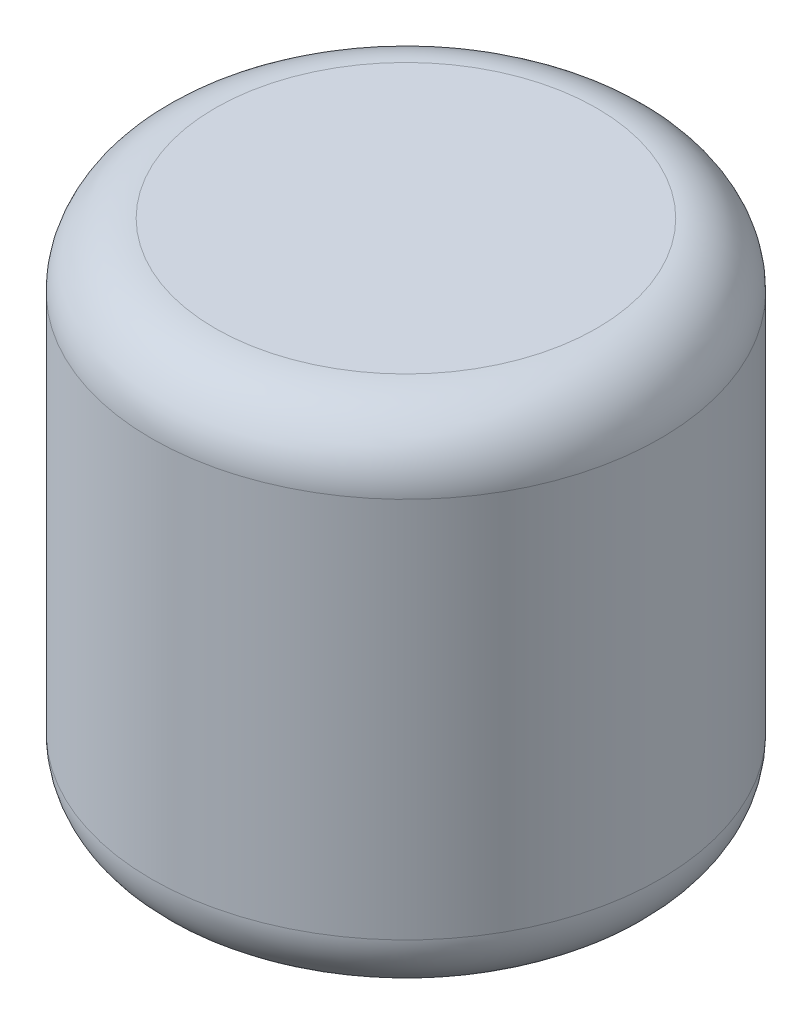
ISO-10303-21;
HEADER;
FILE_DESCRIPTION(('STEP AP214'),'2;1');
FILE_NAME('part.step','',(''),(''),'','','');
FILE_SCHEMA(('AUTOMOTIVE_DESIGN { 1 0 10303 214 1 1 1 1 }'));
ENDSEC;
DATA;
#1=APPLICATION_CONTEXT('core data for automotive mechanical design processes');
#2=APPLICATION_PROTOCOL_DEFINITION('international standard','automotive_design',2000,#1);
#3=PRODUCT_CONTEXT('',#1,'mechanical');
#4=PRODUCT('Part','Part','',(#3));
#5=PRODUCT_RELATED_PRODUCT_CATEGORY('part','',(#4));
#6=PRODUCT_DEFINITION_FORMATION('','',#4);
#7=PRODUCT_DEFINITION_CONTEXT('part definition',#1,'design');
#8=PRODUCT_DEFINITION('design','',#6,#7);
#9=PRODUCT_DEFINITION_SHAPE('','',#8);
#10=(LENGTH_UNIT() NAMED_UNIT(*) SI_UNIT(.MILLI.,.METRE.));
#11=(NAMED_UNIT(*) PLANE_ANGLE_UNIT() SI_UNIT($,.RADIAN.));
#12=(NAMED_UNIT(*) SI_UNIT($,.STERADIAN.) SOLID_ANGLE_UNIT());
#13=UNCERTAINTY_MEASURE_WITH_UNIT(LENGTH_MEASURE(1.E-05),#10,'distance_accuracy_value','');
#14=(GEOMETRIC_REPRESENTATION_CONTEXT(3) GLOBAL_UNCERTAINTY_ASSIGNED_CONTEXT((#13)) GLOBAL_UNIT_ASSIGNED_CONTEXT((#10,
#11,#12)) REPRESENTATION_CONTEXT('',''));
#15=CARTESIAN_POINT('',(0.,0.,0.));
#16=DIRECTION('',(0.,0.,1.));
#17=DIRECTION('',(1.,0.,0.));
#18=AXIS2_PLACEMENT_3D('',#15,#16,#17);
#19=CARTESIAN_POINT('',(0.,2.,0.));
#20=DIRECTION('',(0.,-1.,0.));
#21=DIRECTION('',(0.,0.,-1.));
#22=AXIS2_PLACEMENT_3D('',#19,#20,#21);
#23=CYLINDRICAL_SURFACE('',#22,2.);
#24=CARTESIAN_POINT('',(0.,-1.5,0.));
#25=DIRECTION('',(0.,1.,0.));
#26=DIRECTION('',(0.,0.,1.));
#27=AXIS2_PLACEMENT_3D('',#24,#25,#26);
#28=CIRCLE('',#27,2.);
#29=CARTESIAN_POINT('',(0.,-1.5,2.));
#30=VERTEX_POINT('',#29);
#31=EDGE_CURVE('E43',#30,#30,#28,.T.);
#32=ORIENTED_EDGE('',*,*,#31,.T.);
#33=EDGE_LOOP('',(#32));
#34=FACE_BOUND('',#33,.T.);
#35=CARTESIAN_POINT('',(0.,1.5,0.));
#36=DIRECTION('',(0.,1.,0.));
#37=DIRECTION('',(0.,0.,1.));
#38=AXIS2_PLACEMENT_3D('',#35,#36,#37);
#39=CIRCLE('',#38,2.);
#40=CARTESIAN_POINT('',(0.,1.5,2.));
#41=VERTEX_POINT('',#40);
#42=EDGE_CURVE('E47',#41,#41,#39,.F.);
#43=ORIENTED_EDGE('',*,*,#42,.T.);
#44=EDGE_LOOP('',(#43));
#45=FACE_BOUND('',#44,.T.);
#46=ADVANCED_FACE('F32',(#34,#45),#23,.T.);
#47=CARTESIAN_POINT('',(0.,2.,0.));
#48=DIRECTION('',(0.,1.,0.));
#49=DIRECTION('',(0.,0.,1.));
#50=AXIS2_PLACEMENT_3D('',#47,#48,#49);
#51=PLANE('',#50);
#52=CARTESIAN_POINT('',(0.,2.,0.));
#53=DIRECTION('',(0.,1.,0.));
#54=DIRECTION('',(0.,0.,1.));
#55=AXIS2_PLACEMENT_3D('',#52,#53,#54);
#56=CIRCLE('',#55,1.5);
#57=CARTESIAN_POINT('',(0.,2.,1.5));
#58=VERTEX_POINT('',#57);
#59=EDGE_CURVE('E10',#58,#58,#56,.T.);
#60=ORIENTED_EDGE('',*,*,#59,.T.);
#61=EDGE_LOOP('',(#60));
#62=FACE_BOUND('',#61,.T.);
#63=ADVANCED_FACE('F63',(#62),#51,.T.);
#64=CARTESIAN_POINT('',(0.,-2.,0.));
#65=DIRECTION('',(0.,1.,0.));
#66=DIRECTION('',(0.,0.,1.));
#67=AXIS2_PLACEMENT_3D('',#64,#65,#66);
#68=PLANE('',#67);
#69=CARTESIAN_POINT('',(0.,-2.,0.));
#70=DIRECTION('',(0.,1.,0.));
#71=DIRECTION('',(0.,0.,1.));
#72=AXIS2_PLACEMENT_3D('',#69,#70,#71);
#73=CIRCLE('',#72,1.5);
#74=CARTESIAN_POINT('',(0.,-2.,1.5));
#75=VERTEX_POINT('',#74);
#76=EDGE_CURVE('E39',#75,#75,#73,.F.);
#77=ORIENTED_EDGE('',*,*,#76,.T.);
#78=EDGE_LOOP('',(#77));
#79=FACE_BOUND('',#78,.T.);
#80=ADVANCED_FACE('F60',(#79),#68,.F.);
#81=CARTESIAN_POINT('',(0.,-1.5,0.));
#82=DIRECTION('',(0.,1.,0.));
#83=DIRECTION('',(0.,0.,1.));
#84=AXIS2_PLACEMENT_3D('',#81,#82,#83);
#85=TOROIDAL_SURFACE('',#84,1.5,0.5);
#86=ORIENTED_EDGE('',*,*,#76,.F.);
#87=EDGE_LOOP('',(#86));
#88=FACE_BOUND('',#87,.T.);
#89=ORIENTED_EDGE('',*,*,#31,.F.);
#90=EDGE_LOOP('',(#89));
#91=FACE_BOUND('',#90,.T.);
#92=ADVANCED_FACE('F56',(#88,#91),#85,.T.);
#93=CARTESIAN_POINT('',(0.,1.5,0.));
#94=DIRECTION('',(0.,1.,0.));
#95=DIRECTION('',(0.,0.,1.));
#96=AXIS2_PLACEMENT_3D('',#93,#94,#95);
#97=TOROIDAL_SURFACE('',#96,1.5,0.5);
#98=ORIENTED_EDGE('',*,*,#42,.F.);
#99=EDGE_LOOP('',(#98));
#100=FACE_BOUND('',#99,.T.);
#101=ORIENTED_EDGE('',*,*,#59,.F.);
#102=EDGE_LOOP('',(#101));
#103=FACE_BOUND('',#102,.T.);
#104=ADVANCED_FACE('F34',(#100,#103),#97,.T.);
#105=CLOSED_SHELL('',(#46,#63,#80,#92,#104));
#106=MANIFOLD_SOLID_BREP('B2',#105);
#107=ADVANCED_BREP_SHAPE_REPRESENTATION('',(#18,#106),#14);
#108=SHAPE_DEFINITION_REPRESENTATION(#9,#107);
ENDSEC;
END-ISO-10303-21;
